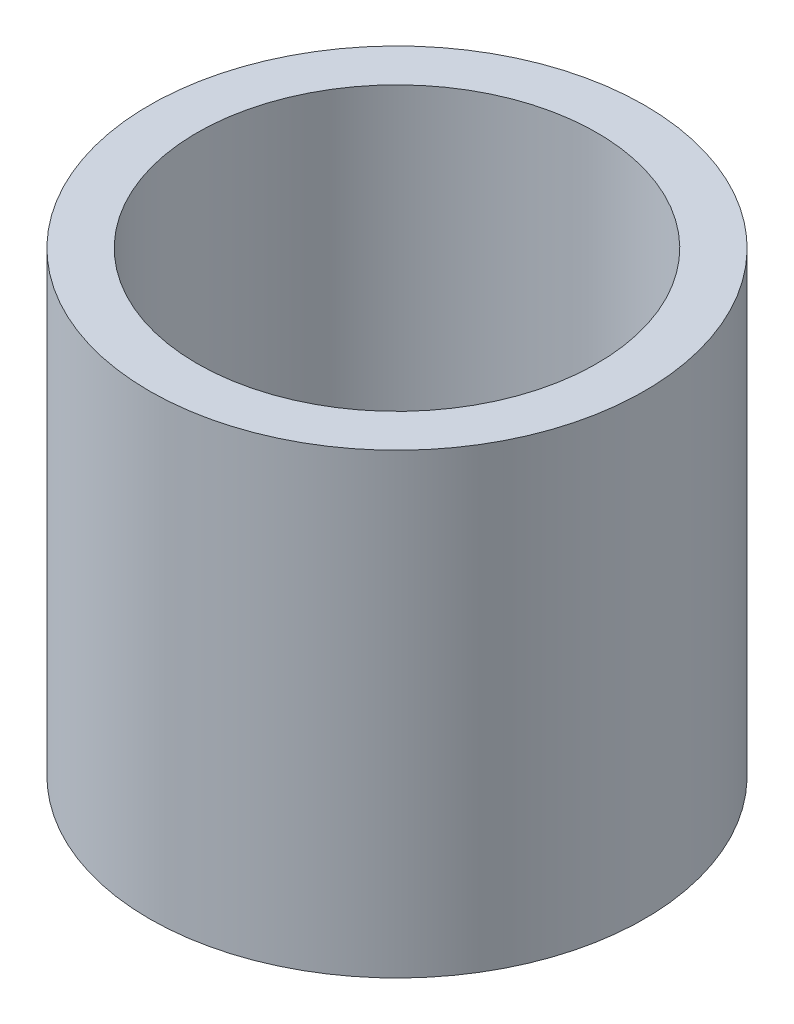
ISO-10303-21;
HEADER;
FILE_DESCRIPTION(('STEP AP214'),'2;1');
FILE_NAME('part.step','',(''),(''),'','','');
FILE_SCHEMA(('AUTOMOTIVE_DESIGN { 1 0 10303 214 1 1 1 1 }'));
ENDSEC;
DATA;
#1=APPLICATION_CONTEXT('core data for automotive mechanical design processes');
#2=APPLICATION_PROTOCOL_DEFINITION('international standard','automotive_design',2000,#1);
#3=PRODUCT_CONTEXT('',#1,'mechanical');
#4=PRODUCT('Part','Part','',(#3));
#5=PRODUCT_RELATED_PRODUCT_CATEGORY('part','',(#4));
#6=PRODUCT_DEFINITION_FORMATION('','',#4);
#7=PRODUCT_DEFINITION_CONTEXT('part definition',#1,'design');
#8=PRODUCT_DEFINITION('design','',#6,#7);
#9=PRODUCT_DEFINITION_SHAPE('','',#8);
#10=(LENGTH_UNIT() NAMED_UNIT(*) SI_UNIT(.MILLI.,.METRE.));
#11=(NAMED_UNIT(*) PLANE_ANGLE_UNIT() SI_UNIT($,.RADIAN.));
#12=(NAMED_UNIT(*) SI_UNIT($,.STERADIAN.) SOLID_ANGLE_UNIT());
#13=UNCERTAINTY_MEASURE_WITH_UNIT(LENGTH_MEASURE(1.E-05),#10,'distance_accuracy_value','');
#14=(GEOMETRIC_REPRESENTATION_CONTEXT(3) GLOBAL_UNCERTAINTY_ASSIGNED_CONTEXT((#13)) GLOBAL_UNIT_ASSIGNED_CONTEXT((#10,
#11,#12)) REPRESENTATION_CONTEXT('',''));
#15=CARTESIAN_POINT('',(0.,0.,0.));
#16=DIRECTION('',(0.,0.,1.));
#17=DIRECTION('',(1.,0.,0.));
#18=AXIS2_PLACEMENT_3D('',#15,#16,#17);
#19=CARTESIAN_POINT('',(0.,240.,0.));
#20=DIRECTION('',(0.,-1.,0.));
#21=DIRECTION('',(0.,0.,-1.));
#22=AXIS2_PLACEMENT_3D('',#19,#20,#21);
#23=CYLINDRICAL_SURFACE('',#22,130.);
#24=CARTESIAN_POINT('',(0.,240.,0.));
#25=DIRECTION('',(0.,1.,0.));
#26=DIRECTION('',(0.,0.,1.));
#27=AXIS2_PLACEMENT_3D('',#24,#25,#26);
#28=CIRCLE('',#27,130.);
#29=CARTESIAN_POINT('',(0.,240.,130.));
#30=VERTEX_POINT('',#29);
#31=EDGE_CURVE('E10',#30,#30,#28,.T.);
#32=ORIENTED_EDGE('',*,*,#31,.F.);
#33=EDGE_LOOP('',(#32));
#34=FACE_BOUND('',#33,.T.);
#35=CARTESIAN_POINT('',(0.,0.,0.));
#36=DIRECTION('',(0.,1.,0.));
#37=DIRECTION('',(0.,0.,1.));
#38=AXIS2_PLACEMENT_3D('',#35,#36,#37);
#39=CIRCLE('',#38,130.);
#40=CARTESIAN_POINT('',(0.,0.,130.));
#41=VERTEX_POINT('',#40);
#42=EDGE_CURVE('E48',#41,#41,#39,.T.);
#43=ORIENTED_EDGE('',*,*,#42,.T.);
#44=EDGE_LOOP('',(#43));
#45=FACE_BOUND('',#44,.T.);
#46=ADVANCED_FACE('F40',(#34,#45),#23,.T.);
#47=CARTESIAN_POINT('',(0.,240.,0.));
#48=DIRECTION('',(0.,1.,0.));
#49=DIRECTION('',(0.,0.,1.));
#50=AXIS2_PLACEMENT_3D('',#47,#48,#49);
#51=PLANE('',#50);
#52=CARTESIAN_POINT('',(0.,240.,0.));
#53=DIRECTION('',(0.,1.,0.));
#54=DIRECTION('',(0.,0.,1.));
#55=AXIS2_PLACEMENT_3D('',#52,#53,#54);
#56=CIRCLE('',#55,105.);
#57=CARTESIAN_POINT('',(0.,240.,105.));
#58=VERTEX_POINT('',#57);
#59=EDGE_CURVE('E57',#58,#58,#56,.T.);
#60=ORIENTED_EDGE('',*,*,#59,.F.);
#61=EDGE_LOOP('',(#60));
#62=FACE_BOUND('',#61,.T.);
#63=ORIENTED_EDGE('',*,*,#31,.T.);
#64=EDGE_LOOP('',(#63));
#65=FACE_BOUND('',#64,.T.);
#66=ADVANCED_FACE('F92',(#62,#65),#51,.T.);
#67=CARTESIAN_POINT('',(0.,0.,0.));
#68=DIRECTION('',(0.,1.,0.));
#69=DIRECTION('',(0.,0.,1.));
#70=AXIS2_PLACEMENT_3D('',#67,#68,#69);
#71=PLANE('',#70);
#72=CARTESIAN_POINT('',(-90.,0.,0.));
#73=DIRECTION('',(0.,1.,0.));
#74=DIRECTION('',(0.,0.,1.));
#75=AXIS2_PLACEMENT_3D('',#72,#73,#74);
#76=CIRCLE('',#75,12.5);
#77=CARTESIAN_POINT('',(-90.,0.,12.5));
#78=VERTEX_POINT('',#77);
#79=EDGE_CURVE('E79',#78,#78,#76,.T.);
#80=ORIENTED_EDGE('',*,*,#79,.T.);
#81=EDGE_LOOP('',(#80));
#82=FACE_BOUND('',#81,.T.);
#83=CARTESIAN_POINT('',(90.,0.,0.));
#84=DIRECTION('',(0.,1.,0.));
#85=DIRECTION('',(0.,0.,1.));
#86=AXIS2_PLACEMENT_3D('',#83,#84,#85);
#87=CIRCLE('',#86,12.5);
#88=CARTESIAN_POINT('',(90.,0.,12.5));
#89=VERTEX_POINT('',#88);
#90=EDGE_CURVE('E67',#89,#89,#87,.T.);
#91=ORIENTED_EDGE('',*,*,#90,.T.);
#92=EDGE_LOOP('',(#91));
#93=FACE_BOUND('',#92,.T.);
#94=CARTESIAN_POINT('',(0.,0.,0.));
#95=DIRECTION('',(0.,1.,0.));
#96=DIRECTION('',(0.,0.,1.));
#97=AXIS2_PLACEMENT_3D('',#94,#95,#96);
#98=CIRCLE('',#97,32.5);
#99=CARTESIAN_POINT('',(0.,0.,32.5));
#100=VERTEX_POINT('',#99);
#101=EDGE_CURVE('E63',#100,#100,#98,.T.);
#102=ORIENTED_EDGE('',*,*,#101,.T.);
#103=EDGE_LOOP('',(#102));
#104=FACE_BOUND('',#103,.T.);
#105=ORIENTED_EDGE('',*,*,#42,.F.);
#106=EDGE_LOOP('',(#105));
#107=FACE_BOUND('',#106,.T.);
#108=ADVANCED_FACE('F94',(#82,#93,#104,#107),#71,.F.);
#109=CARTESIAN_POINT('',(0.,70.,0.));
#110=DIRECTION('',(0.,1.,0.));
#111=DIRECTION('',(0.,0.,1.));
#112=AXIS2_PLACEMENT_3D('',#109,#110,#111);
#113=CYLINDRICAL_SURFACE('',#112,105.);
#114=CARTESIAN_POINT('',(0.,70.,0.));
#115=DIRECTION('',(0.,1.,0.));
#116=DIRECTION('',(0.,0.,1.));
#117=AXIS2_PLACEMENT_3D('',#114,#115,#116);
#118=CIRCLE('',#117,105.);
#119=CARTESIAN_POINT('',(0.,70.,105.));
#120=VERTEX_POINT('',#119);
#121=EDGE_CURVE('E54',#120,#120,#118,.T.);
#122=ORIENTED_EDGE('',*,*,#121,.F.);
#123=EDGE_LOOP('',(#122));
#124=FACE_BOUND('',#123,.T.);
#125=ORIENTED_EDGE('',*,*,#59,.T.);
#126=EDGE_LOOP('',(#125));
#127=FACE_BOUND('',#126,.T.);
#128=ADVANCED_FACE('F90',(#124,#127),#113,.F.);
#129=CARTESIAN_POINT('',(0.,70.,0.));
#130=DIRECTION('',(0.,1.,0.));
#131=DIRECTION('',(0.,0.,1.));
#132=AXIS2_PLACEMENT_3D('',#129,#130,#131);
#133=PLANE('',#132);
#134=CARTESIAN_POINT('',(-90.,70.,0.));
#135=DIRECTION('',(0.,1.,0.));
#136=DIRECTION('',(0.,0.,1.));
#137=AXIS2_PLACEMENT_3D('',#134,#135,#136);
#138=CIRCLE('',#137,12.5);
#139=CARTESIAN_POINT('',(-90.,70.,12.5));
#140=VERTEX_POINT('',#139);
#141=EDGE_CURVE('E43',#140,#140,#138,.T.);
#142=ORIENTED_EDGE('',*,*,#141,.F.);
#143=EDGE_LOOP('',(#142));
#144=FACE_BOUND('',#143,.T.);
#145=CARTESIAN_POINT('',(90.,70.,0.));
#146=DIRECTION('',(0.,1.,0.));
#147=DIRECTION('',(0.,0.,1.));
#148=AXIS2_PLACEMENT_3D('',#145,#146,#147);
#149=CIRCLE('',#148,12.5);
#150=CARTESIAN_POINT('',(90.,70.,12.5));
#151=VERTEX_POINT('',#150);
#152=EDGE_CURVE('E64',#151,#151,#149,.T.);
#153=ORIENTED_EDGE('',*,*,#152,.F.);
#154=EDGE_LOOP('',(#153));
#155=FACE_BOUND('',#154,.T.);
#156=CARTESIAN_POINT('',(0.,70.,0.));
#157=DIRECTION('',(0.,1.,0.));
#158=DIRECTION('',(0.,0.,1.));
#159=AXIS2_PLACEMENT_3D('',#156,#157,#158);
#160=CIRCLE('',#159,32.5);
#161=CARTESIAN_POINT('',(0.,70.,32.5));
#162=VERTEX_POINT('',#161);
#163=EDGE_CURVE('E60',#162,#162,#160,.T.);
#164=ORIENTED_EDGE('',*,*,#163,.F.);
#165=EDGE_LOOP('',(#164));
#166=FACE_BOUND('',#165,.T.);
#167=ORIENTED_EDGE('',*,*,#121,.T.);
#168=EDGE_LOOP('',(#167));
#169=FACE_BOUND('',#168,.T.);
#170=ADVANCED_FACE('F105',(#144,#155,#166,#169),#133,.T.);
#171=CARTESIAN_POINT('',(0.,240.,0.));
#172=DIRECTION('',(0.,-1.,0.));
#173=DIRECTION('',(0.,0.,-1.));
#174=AXIS2_PLACEMENT_3D('',#171,#172,#173);
#175=CYLINDRICAL_SURFACE('',#174,32.5);
#176=ORIENTED_EDGE('',*,*,#163,.T.);
#177=EDGE_LOOP('',(#176));
#178=FACE_BOUND('',#177,.T.);
#179=ORIENTED_EDGE('',*,*,#101,.F.);
#180=EDGE_LOOP('',(#179));
#181=FACE_BOUND('',#180,.T.);
#182=ADVANCED_FACE('F109',(#178,#181),#175,.F.);
#183=CARTESIAN_POINT('',(90.,240.,0.));
#184=DIRECTION('',(0.,-1.,0.));
#185=DIRECTION('',(0.,0.,-1.));
#186=AXIS2_PLACEMENT_3D('',#183,#184,#185);
#187=CYLINDRICAL_SURFACE('',#186,12.5);
#188=ORIENTED_EDGE('',*,*,#152,.T.);
#189=EDGE_LOOP('',(#188));
#190=FACE_BOUND('',#189,.T.);
#191=ORIENTED_EDGE('',*,*,#90,.F.);
#192=EDGE_LOOP('',(#191));
#193=FACE_BOUND('',#192,.T.);
#194=ADVANCED_FACE('F113',(#190,#193),#187,.F.);
#195=CARTESIAN_POINT('',(-90.,240.,0.));
#196=DIRECTION('',(0.,-1.,0.));
#197=DIRECTION('',(0.,0.,-1.));
#198=AXIS2_PLACEMENT_3D('',#195,#196,#197);
#199=CYLINDRICAL_SURFACE('',#198,12.5);
#200=ORIENTED_EDGE('',*,*,#141,.T.);
#201=EDGE_LOOP('',(#200));
#202=FACE_BOUND('',#201,.T.);
#203=ORIENTED_EDGE('',*,*,#79,.F.);
#204=EDGE_LOOP('',(#203));
#205=FACE_BOUND('',#204,.T.);
#206=ADVANCED_FACE('F117',(#202,#205),#199,.F.);
#207=CLOSED_SHELL('',(#46,#66,#108,#128,#170,#182,#194,#206));
#208=MANIFOLD_SOLID_BREP('B2',#207);
#209=ADVANCED_BREP_SHAPE_REPRESENTATION('',(#18,#208),#14);
#210=SHAPE_DEFINITION_REPRESENTATION(#9,#209);
ENDSEC;
END-ISO-10303-21;
